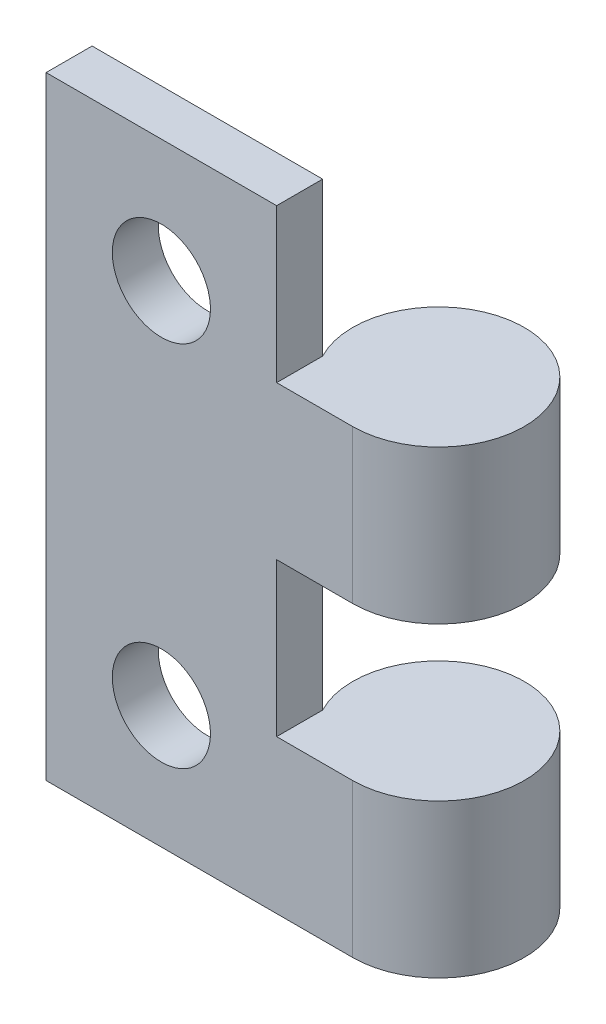
ISO-10303-21;
HEADER;
FILE_DESCRIPTION(('STEP AP214'),'2;1');
FILE_NAME('part.step','',(''),(''),'','','');
FILE_SCHEMA(('AUTOMOTIVE_DESIGN { 1 0 10303 214 1 1 1 1 }'));
ENDSEC;
DATA;
#1=APPLICATION_CONTEXT('core data for automotive mechanical design processes');
#2=APPLICATION_PROTOCOL_DEFINITION('international standard','automotive_design',2000,#1);
#3=PRODUCT_CONTEXT('',#1,'mechanical');
#4=PRODUCT('Part','Part','',(#3));
#5=PRODUCT_RELATED_PRODUCT_CATEGORY('part','',(#4));
#6=PRODUCT_DEFINITION_FORMATION('','',#4);
#7=PRODUCT_DEFINITION_CONTEXT('part definition',#1,'design');
#8=PRODUCT_DEFINITION('design','',#6,#7);
#9=PRODUCT_DEFINITION_SHAPE('','',#8);
#10=(LENGTH_UNIT() NAMED_UNIT(*) SI_UNIT(.MILLI.,.METRE.));
#11=(NAMED_UNIT(*) PLANE_ANGLE_UNIT() SI_UNIT($,.RADIAN.));
#12=(NAMED_UNIT(*) SI_UNIT($,.STERADIAN.) SOLID_ANGLE_UNIT());
#13=UNCERTAINTY_MEASURE_WITH_UNIT(LENGTH_MEASURE(1.E-05),#10,'distance_accuracy_value','');
#14=(GEOMETRIC_REPRESENTATION_CONTEXT(3) GLOBAL_UNCERTAINTY_ASSIGNED_CONTEXT((#13)) GLOBAL_UNIT_ASSIGNED_CONTEXT((#10,
#11,#12)) REPRESENTATION_CONTEXT('',''));
#15=CARTESIAN_POINT('',(0.,0.,0.));
#16=DIRECTION('',(0.,0.,1.));
#17=DIRECTION('',(1.,0.,0.));
#18=AXIS2_PLACEMENT_3D('',#15,#16,#17);
#19=CARTESIAN_POINT('',(5.00000000000001,20.,-2.05));
#20=DIRECTION('',(0.,-1.,0.));
#21=DIRECTION('',(0.,0.,-1.));
#22=AXIS2_PLACEMENT_3D('',#19,#20,#21);
#23=CYLINDRICAL_SURFACE('',#22,2.8);
#24=CARTESIAN_POINT('',(5.00000000000001,5.,-2.05));
#25=DIRECTION('',(0.,1.,0.));
#26=DIRECTION('',(0.,0.,1.));
#27=AXIS2_PLACEMENT_3D('',#24,#25,#26);
#28=CIRCLE('',#27,2.8);
#29=CARTESIAN_POINT('',(5.,5.,0.75));
#30=VERTEX_POINT('',#29);
#31=CARTESIAN_POINT('',(2.52008064647256,5.,-0.75));
#32=VERTEX_POINT('',#31);
#33=EDGE_CURVE('E86',#30,#32,#28,.T.);
#34=ORIENTED_EDGE('',*,*,#33,.F.);
#35=DIRECTION('',(0.,-1.,0.));
#36=VECTOR('',#35,1.);
#37=CARTESIAN_POINT('',(5.,20.,0.75));
#38=LINE('',#37,#36);
#39=CARTESIAN_POINT('',(5.,0.,0.75));
#40=VERTEX_POINT('',#39);
#41=EDGE_CURVE('E80',#30,#40,#38,.T.);
#42=ORIENTED_EDGE('',*,*,#41,.T.);
#43=CARTESIAN_POINT('',(5.00000000000001,0.,-2.05));
#44=DIRECTION('',(0.,1.,0.));
#45=DIRECTION('',(0.,0.,1.));
#46=AXIS2_PLACEMENT_3D('',#43,#44,#45);
#47=CIRCLE('',#46,2.8);
#48=CARTESIAN_POINT('',(2.52008064647256,0.,-0.75));
#49=VERTEX_POINT('',#48);
#50=EDGE_CURVE('E83',#40,#49,#47,.T.);
#51=ORIENTED_EDGE('',*,*,#50,.T.);
#52=DIRECTION('',(0.,-1.,0.));
#53=VECTOR('',#52,1.);
#54=CARTESIAN_POINT('',(2.52008064647256,20.,-0.75));
#55=LINE('',#54,#53);
#56=EDGE_CURVE('E114',#32,#49,#55,.T.);
#57=ORIENTED_EDGE('',*,*,#56,.F.);
#58=EDGE_LOOP('',(#34,#42,#51,#57));
#59=FACE_BOUND('',#58,.T.);
#60=ADVANCED_FACE('F41',(#59),#23,.T.);
#61=CARTESIAN_POINT('',(5.,15.,0.75));
#62=VERTEX_POINT('',#61);
#63=CARTESIAN_POINT('',(5.,10.,0.75));
#64=VERTEX_POINT('',#63);
#65=EDGE_CURVE('E88',#62,#64,#38,.T.);
#66=ORIENTED_EDGE('',*,*,#65,.T.);
#67=CARTESIAN_POINT('',(5.00000000000001,10.,-2.05));
#68=DIRECTION('',(0.,1.,0.));
#69=DIRECTION('',(0.,0.,1.));
#70=AXIS2_PLACEMENT_3D('',#67,#68,#69);
#71=CIRCLE('',#70,2.8);
#72=CARTESIAN_POINT('',(2.52008064647256,10.,-0.75));
#73=VERTEX_POINT('',#72);
#74=EDGE_CURVE('E105',#64,#73,#71,.T.);
#75=ORIENTED_EDGE('',*,*,#74,.T.);
#76=CARTESIAN_POINT('',(2.52008064647256,15.,-0.75));
#77=VERTEX_POINT('',#76);
#78=EDGE_CURVE('E116',#77,#73,#55,.T.);
#79=ORIENTED_EDGE('',*,*,#78,.F.);
#80=CARTESIAN_POINT('',(5.00000000000001,15.,-2.05));
#81=DIRECTION('',(0.,1.,0.));
#82=DIRECTION('',(0.,0.,1.));
#83=AXIS2_PLACEMENT_3D('',#80,#81,#82);
#84=CIRCLE('',#83,2.8);
#85=EDGE_CURVE('E101',#62,#77,#84,.T.);
#86=ORIENTED_EDGE('',*,*,#85,.F.);
#87=EDGE_LOOP('',(#66,#75,#79,#86));
#88=FACE_BOUND('',#87,.T.);
#89=ADVANCED_FACE('F195',(#88),#23,.T.);
#90=CARTESIAN_POINT('',(0.,20.,-0.75));
#91=DIRECTION('',(0.,0.,-1.));
#92=DIRECTION('',(-1.,0.,0.));
#93=AXIS2_PLACEMENT_3D('',#90,#91,#92);
#94=PLANE('',#93);
#95=CARTESIAN_POINT('',(-1.23995967676372,16.,-0.75));
#96=DIRECTION('',(0.,0.,-1.));
#97=DIRECTION('',(-1.,0.,0.));
#98=AXIS2_PLACEMENT_3D('',#95,#96,#97);
#99=CIRCLE('',#98,1.6);
#100=CARTESIAN_POINT('',(-2.83995967676372,16.,-0.75));
#101=VERTEX_POINT('',#100);
#102=EDGE_CURVE('E129',#101,#101,#99,.T.);
#103=ORIENTED_EDGE('',*,*,#102,.F.);
#104=EDGE_LOOP('',(#103));
#105=FACE_BOUND('',#104,.T.);
#106=CARTESIAN_POINT('',(-1.23995967676372,4.,-0.75));
#107=DIRECTION('',(0.,0.,-1.));
#108=DIRECTION('',(-1.,0.,0.));
#109=AXIS2_PLACEMENT_3D('',#106,#107,#108);
#110=CIRCLE('',#109,1.6);
#111=CARTESIAN_POINT('',(-2.83995967676372,4.,-0.75));
#112=VERTEX_POINT('',#111);
#113=EDGE_CURVE('E135',#112,#112,#110,.T.);
#114=ORIENTED_EDGE('',*,*,#113,.F.);
#115=EDGE_LOOP('',(#114));
#116=FACE_BOUND('',#115,.T.);
#117=ORIENTED_EDGE('',*,*,#78,.T.);
#118=DIRECTION('',(0.,-1.,0.));
#119=VECTOR('',#118,1.);
#120=CARTESIAN_POINT('',(2.52008064647256,10.,-0.75));
#121=LINE('',#120,#119);
#122=EDGE_CURVE('E142',#73,#32,#121,.T.);
#123=ORIENTED_EDGE('',*,*,#122,.T.);
#124=ORIENTED_EDGE('',*,*,#56,.T.);
#125=DIRECTION('',(1.,0.,0.));
#126=VECTOR('',#125,1.);
#127=CARTESIAN_POINT('',(0.,0.,-0.75));
#128=LINE('',#127,#126);
#129=CARTESIAN_POINT('',(-5.,0.,-0.75));
#130=VERTEX_POINT('',#129);
#131=EDGE_CURVE('E100',#130,#49,#128,.T.);
#132=ORIENTED_EDGE('',*,*,#131,.F.);
#133=DIRECTION('',(0.,-1.,0.));
#134=VECTOR('',#133,1.);
#135=CARTESIAN_POINT('',(-5.,20.,-0.75));
#136=LINE('',#135,#134);
#137=CARTESIAN_POINT('',(-5.,20.,-0.75));
#138=VERTEX_POINT('',#137);
#139=EDGE_CURVE('E112',#138,#130,#136,.T.);
#140=ORIENTED_EDGE('',*,*,#139,.F.);
#141=DIRECTION('',(1.,0.,0.));
#142=VECTOR('',#141,1.);
#143=CARTESIAN_POINT('',(0.,20.,-0.75));
#144=LINE('',#143,#142);
#145=CARTESIAN_POINT('',(2.52008064647256,20.,-0.75));
#146=VERTEX_POINT('',#145);
#147=EDGE_CURVE('E95',#138,#146,#144,.T.);
#148=ORIENTED_EDGE('',*,*,#147,.T.);
#149=DIRECTION('',(0.,1.,0.));
#150=VECTOR('',#149,1.);
#151=CARTESIAN_POINT('',(2.52008064647256,15.,-0.75));
#152=LINE('',#151,#150);
#153=EDGE_CURVE('E146',#77,#146,#152,.T.);
#154=ORIENTED_EDGE('',*,*,#153,.F.);
#155=EDGE_LOOP('',(#117,#123,#124,#132,#140,#148,#154));
#156=FACE_BOUND('',#155,.T.);
#157=ADVANCED_FACE('F198',(#105,#116,#156),#94,.T.);
#158=CARTESIAN_POINT('',(0.,20.,0.75));
#159=DIRECTION('',(0.,0.,-1.));
#160=DIRECTION('',(-1.,0.,0.));
#161=AXIS2_PLACEMENT_3D('',#158,#159,#160);
#162=PLANE('',#161);
#163=CARTESIAN_POINT('',(-1.23995967676372,16.,0.750000000000001));
#164=DIRECTION('',(0.,0.,-1.));
#165=DIRECTION('',(-1.,0.,0.));
#166=AXIS2_PLACEMENT_3D('',#163,#164,#165);
#167=CIRCLE('',#166,1.6);
#168=CARTESIAN_POINT('',(-2.83995967676372,16.,0.750000000000001));
#169=VERTEX_POINT('',#168);
#170=EDGE_CURVE('E44',#169,#169,#167,.T.);
#171=ORIENTED_EDGE('',*,*,#170,.T.);
#172=EDGE_LOOP('',(#171));
#173=FACE_BOUND('',#172,.T.);
#174=CARTESIAN_POINT('',(-1.23995967676372,4.,0.750000000000001));
#175=DIRECTION('',(0.,0.,-1.));
#176=DIRECTION('',(-1.,0.,0.));
#177=AXIS2_PLACEMENT_3D('',#174,#175,#176);
#178=CIRCLE('',#177,1.6);
#179=CARTESIAN_POINT('',(-2.83995967676372,4.,0.750000000000001));
#180=VERTEX_POINT('',#179);
#181=EDGE_CURVE('E127',#180,#180,#178,.T.);
#182=ORIENTED_EDGE('',*,*,#181,.T.);
#183=EDGE_LOOP('',(#182));
#184=FACE_BOUND('',#183,.T.);
#185=DIRECTION('',(1.,0.,0.));
#186=VECTOR('',#185,1.);
#187=CARTESIAN_POINT('',(0.,5.,0.75));
#188=LINE('',#187,#186);
#189=CARTESIAN_POINT('',(2.52008064647256,5.,0.750000000000001));
#190=VERTEX_POINT('',#189);
#191=EDGE_CURVE('E12',#190,#30,#188,.T.);
#192=ORIENTED_EDGE('',*,*,#191,.F.);
#193=DIRECTION('',(0.,-1.,0.));
#194=VECTOR('',#193,1.);
#195=CARTESIAN_POINT('',(2.52008064647256,20.,0.75));
#196=LINE('',#195,#194);
#197=CARTESIAN_POINT('',(2.52008064647256,10.,0.750000000000001));
#198=VERTEX_POINT('',#197);
#199=EDGE_CURVE('E123',#198,#190,#196,.T.);
#200=ORIENTED_EDGE('',*,*,#199,.F.);
#201=DIRECTION('',(1.,0.,0.));
#202=VECTOR('',#201,1.);
#203=CARTESIAN_POINT('',(0.,10.,0.75));
#204=LINE('',#203,#202);
#205=EDGE_CURVE('E50',#198,#64,#204,.T.);
#206=ORIENTED_EDGE('',*,*,#205,.T.);
#207=ORIENTED_EDGE('',*,*,#65,.F.);
#208=DIRECTION('',(1.,0.,0.));
#209=VECTOR('',#208,1.);
#210=CARTESIAN_POINT('',(0.,15.,0.75));
#211=LINE('',#210,#209);
#212=CARTESIAN_POINT('',(2.52008064647256,15.,0.750000000000001));
#213=VERTEX_POINT('',#212);
#214=EDGE_CURVE('E117',#213,#62,#211,.T.);
#215=ORIENTED_EDGE('',*,*,#214,.F.);
#216=DIRECTION('',(0.,1.,0.));
#217=VECTOR('',#216,1.);
#218=CARTESIAN_POINT('',(2.52008064647256,20.,0.75));
#219=LINE('',#218,#217);
#220=CARTESIAN_POINT('',(2.52008064647256,20.,0.750000000000001));
#221=VERTEX_POINT('',#220);
#222=EDGE_CURVE('E120',#213,#221,#219,.T.);
#223=ORIENTED_EDGE('',*,*,#222,.T.);
#224=DIRECTION('',(1.,0.,0.));
#225=VECTOR('',#224,1.);
#226=CARTESIAN_POINT('',(0.,20.,0.75));
#227=LINE('',#226,#225);
#228=CARTESIAN_POINT('',(-5.,20.,0.75));
#229=VERTEX_POINT('',#228);
#230=EDGE_CURVE('E89',#229,#221,#227,.T.);
#231=ORIENTED_EDGE('',*,*,#230,.F.);
#232=DIRECTION('',(0.,-1.,0.));
#233=VECTOR('',#232,1.);
#234=CARTESIAN_POINT('',(-5.,20.,0.75));
#235=LINE('',#234,#233);
#236=CARTESIAN_POINT('',(-5.,0.,0.75));
#237=VERTEX_POINT('',#236);
#238=EDGE_CURVE('E59',#229,#237,#235,.T.);
#239=ORIENTED_EDGE('',*,*,#238,.T.);
#240=DIRECTION('',(1.,0.,0.));
#241=VECTOR('',#240,1.);
#242=CARTESIAN_POINT('',(0.,0.,0.75));
#243=LINE('',#242,#241);
#244=EDGE_CURVE('E91',#237,#40,#243,.T.);
#245=ORIENTED_EDGE('',*,*,#244,.T.);
#246=ORIENTED_EDGE('',*,*,#41,.F.);
#247=EDGE_LOOP('',(#192,#200,#206,#207,#215,#223,#231,#239,#245,#246));
#248=FACE_BOUND('',#247,.T.);
#249=ADVANCED_FACE('F92',(#173,#184,#248),#162,.F.);
#250=CARTESIAN_POINT('',(0.,20.,0.));
#251=DIRECTION('',(0.,1.,0.));
#252=DIRECTION('',(0.,0.,1.));
#253=AXIS2_PLACEMENT_3D('',#250,#251,#252);
#254=PLANE('',#253);
#255=DIRECTION('',(0.,0.,-1.));
#256=VECTOR('',#255,1.);
#257=CARTESIAN_POINT('',(2.52008064647256,20.,22.25));
#258=LINE('',#257,#256);
#259=EDGE_CURVE('E133',#221,#146,#258,.T.);
#260=ORIENTED_EDGE('',*,*,#259,.T.);
#261=ORIENTED_EDGE('',*,*,#147,.F.);
#262=DIRECTION('',(0.,0.,-1.));
#263=VECTOR('',#262,1.);
#264=CARTESIAN_POINT('',(-5.,20.,0.));
#265=LINE('',#264,#263);
#266=EDGE_CURVE('E163',#229,#138,#265,.T.);
#267=ORIENTED_EDGE('',*,*,#266,.F.);
#268=ORIENTED_EDGE('',*,*,#230,.T.);
#269=EDGE_LOOP('',(#260,#261,#267,#268));
#270=FACE_BOUND('',#269,.T.);
#271=ADVANCED_FACE('F168',(#270),#254,.T.);
#272=CARTESIAN_POINT('',(-5.,20.,0.));
#273=DIRECTION('',(-1.,0.,0.));
#274=DIRECTION('',(0.,0.,1.));
#275=AXIS2_PLACEMENT_3D('',#272,#273,#274);
#276=PLANE('',#275);
#277=DIRECTION('',(0.,0.,-1.));
#278=VECTOR('',#277,1.);
#279=CARTESIAN_POINT('',(-5.,0.,0.));
#280=LINE('',#279,#278);
#281=EDGE_CURVE('E96',#237,#130,#280,.T.);
#282=ORIENTED_EDGE('',*,*,#281,.F.);
#283=ORIENTED_EDGE('',*,*,#238,.F.);
#284=ORIENTED_EDGE('',*,*,#266,.T.);
#285=ORIENTED_EDGE('',*,*,#139,.T.);
#286=EDGE_LOOP('',(#282,#283,#284,#285));
#287=FACE_BOUND('',#286,.T.);
#288=ADVANCED_FACE('F219',(#287),#276,.T.);
#289=CARTESIAN_POINT('',(0.,0.,0.));
#290=DIRECTION('',(0.,1.,0.));
#291=DIRECTION('',(0.,0.,1.));
#292=AXIS2_PLACEMENT_3D('',#289,#290,#291);
#293=PLANE('',#292);
#294=ORIENTED_EDGE('',*,*,#50,.F.);
#295=ORIENTED_EDGE('',*,*,#244,.F.);
#296=ORIENTED_EDGE('',*,*,#281,.T.);
#297=ORIENTED_EDGE('',*,*,#131,.T.);
#298=EDGE_LOOP('',(#294,#295,#296,#297));
#299=FACE_BOUND('',#298,.T.);
#300=ADVANCED_FACE('F98',(#299),#293,.F.);
#301=CARTESIAN_POINT('',(18.,15.,0.));
#302=DIRECTION('',(0.,1.,0.));
#303=DIRECTION('',(0.,0.,1.));
#304=AXIS2_PLACEMENT_3D('',#301,#302,#303);
#305=PLANE('',#304);
#306=ORIENTED_EDGE('',*,*,#85,.T.);
#307=DIRECTION('',(0.,0.,-1.));
#308=VECTOR('',#307,1.);
#309=CARTESIAN_POINT('',(2.52008064647256,15.,22.25));
#310=LINE('',#309,#308);
#311=EDGE_CURVE('E152',#213,#77,#310,.T.);
#312=ORIENTED_EDGE('',*,*,#311,.F.);
#313=ORIENTED_EDGE('',*,*,#214,.T.);
#314=EDGE_LOOP('',(#306,#312,#313));
#315=FACE_BOUND('',#314,.T.);
#316=ADVANCED_FACE('F187',(#315),#305,.T.);
#317=CARTESIAN_POINT('',(18.,10.,0.));
#318=DIRECTION('',(0.,1.,0.));
#319=DIRECTION('',(0.,0.,1.));
#320=AXIS2_PLACEMENT_3D('',#317,#318,#319);
#321=PLANE('',#320);
#322=ORIENTED_EDGE('',*,*,#74,.F.);
#323=ORIENTED_EDGE('',*,*,#205,.F.);
#324=DIRECTION('',(0.,0.,-1.));
#325=VECTOR('',#324,1.);
#326=CARTESIAN_POINT('',(2.52008064647256,10.,22.25));
#327=LINE('',#326,#325);
#328=EDGE_CURVE('E149',#198,#73,#327,.T.);
#329=ORIENTED_EDGE('',*,*,#328,.T.);
#330=EDGE_LOOP('',(#322,#323,#329));
#331=FACE_BOUND('',#330,.T.);
#332=ADVANCED_FACE('F212',(#331),#321,.F.);
#333=CARTESIAN_POINT('',(18.,5.,0.));
#334=DIRECTION('',(0.,1.,0.));
#335=DIRECTION('',(0.,0.,1.));
#336=AXIS2_PLACEMENT_3D('',#333,#334,#335);
#337=PLANE('',#336);
#338=ORIENTED_EDGE('',*,*,#33,.T.);
#339=DIRECTION('',(0.,0.,-1.));
#340=VECTOR('',#339,1.);
#341=CARTESIAN_POINT('',(2.52008064647256,5.,22.25));
#342=LINE('',#341,#340);
#343=EDGE_CURVE('E145',#190,#32,#342,.T.);
#344=ORIENTED_EDGE('',*,*,#343,.F.);
#345=ORIENTED_EDGE('',*,*,#191,.T.);
#346=EDGE_LOOP('',(#338,#344,#345));
#347=FACE_BOUND('',#346,.T.);
#348=ADVANCED_FACE('F218',(#347),#337,.T.);
#349=CARTESIAN_POINT('',(2.52008064647256,10.,22.25));
#350=DIRECTION('',(1.,0.,0.));
#351=DIRECTION('',(0.,0.,-1.));
#352=AXIS2_PLACEMENT_3D('',#349,#350,#351);
#353=PLANE('',#352);
#354=ORIENTED_EDGE('',*,*,#199,.T.);
#355=ORIENTED_EDGE('',*,*,#343,.T.);
#356=ORIENTED_EDGE('',*,*,#122,.F.);
#357=ORIENTED_EDGE('',*,*,#328,.F.);
#358=EDGE_LOOP('',(#354,#355,#356,#357));
#359=FACE_BOUND('',#358,.T.);
#360=ADVANCED_FACE('F216',(#359),#353,.T.);
#361=CARTESIAN_POINT('',(2.52008064647256,15.,22.25));
#362=DIRECTION('',(-1.,0.,0.));
#363=DIRECTION('',(0.,0.,1.));
#364=AXIS2_PLACEMENT_3D('',#361,#362,#363);
#365=PLANE('',#364);
#366=ORIENTED_EDGE('',*,*,#311,.T.);
#367=ORIENTED_EDGE('',*,*,#153,.T.);
#368=ORIENTED_EDGE('',*,*,#259,.F.);
#369=ORIENTED_EDGE('',*,*,#222,.F.);
#370=EDGE_LOOP('',(#366,#367,#368,#369));
#371=FACE_BOUND('',#370,.T.);
#372=ADVANCED_FACE('F181',(#371),#365,.F.);
#373=CARTESIAN_POINT('',(-1.23995967676372,4.,22.25));
#374=DIRECTION('',(0.,0.,-1.));
#375=DIRECTION('',(-1.,0.,0.));
#376=AXIS2_PLACEMENT_3D('',#373,#374,#375);
#377=CYLINDRICAL_SURFACE('',#376,1.6);
#378=ORIENTED_EDGE('',*,*,#113,.T.);
#379=EDGE_LOOP('',(#378));
#380=FACE_BOUND('',#379,.T.);
#381=ORIENTED_EDGE('',*,*,#181,.F.);
#382=EDGE_LOOP('',(#381));
#383=FACE_BOUND('',#382,.T.);
#384=ADVANCED_FACE('F244',(#380,#383),#377,.F.);
#385=CARTESIAN_POINT('',(-1.23995967676372,16.,22.25));
#386=DIRECTION('',(0.,0.,-1.));
#387=DIRECTION('',(-1.,0.,0.));
#388=AXIS2_PLACEMENT_3D('',#385,#386,#387);
#389=CYLINDRICAL_SURFACE('',#388,1.6);
#390=ORIENTED_EDGE('',*,*,#102,.T.);
#391=EDGE_LOOP('',(#390));
#392=FACE_BOUND('',#391,.T.);
#393=ORIENTED_EDGE('',*,*,#170,.F.);
#394=EDGE_LOOP('',(#393));
#395=FACE_BOUND('',#394,.T.);
#396=ADVANCED_FACE('F247',(#392,#395),#389,.F.);
#397=CLOSED_SHELL('',(#60,#89,#157,#249,#271,#288,#300,#316,#332,#348,#360,#372,#384,#396));
#398=MANIFOLD_SOLID_BREP('B2',#397);
#399=ADVANCED_BREP_SHAPE_REPRESENTATION('',(#18,#398),#14);
#400=SHAPE_DEFINITION_REPRESENTATION(#9,#399);
ENDSEC;
END-ISO-10303-21;
